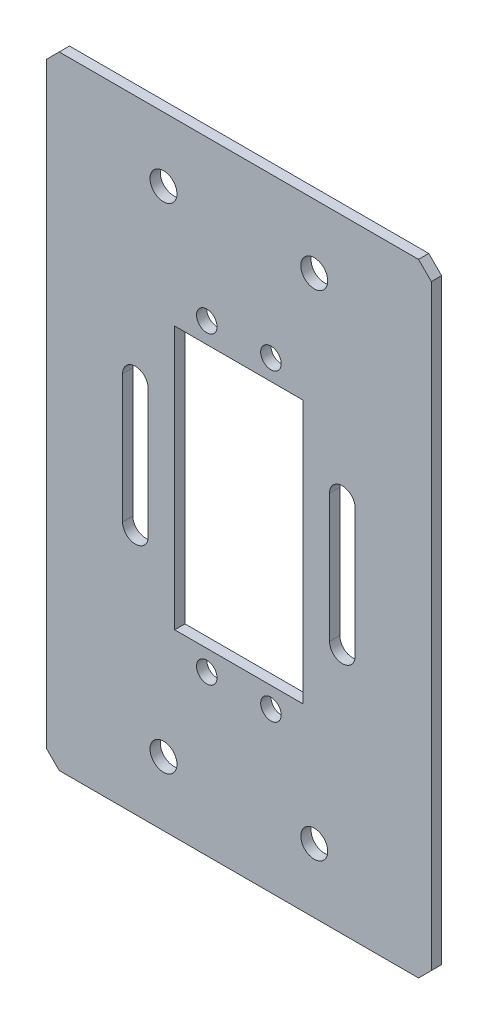
ISO-10303-21;
HEADER;
FILE_DESCRIPTION(('STEP AP214'),'2;1');
FILE_NAME('part.step','',(''),(''),'','','');
FILE_SCHEMA(('AUTOMOTIVE_DESIGN { 1 0 10303 214 1 1 1 1 }'));
ENDSEC;
DATA;
#1=APPLICATION_CONTEXT('core data for automotive mechanical design processes');
#2=APPLICATION_PROTOCOL_DEFINITION('international standard','automotive_design',2000,#1);
#3=PRODUCT_CONTEXT('',#1,'mechanical');
#4=PRODUCT('Part','Part','',(#3));
#5=PRODUCT_RELATED_PRODUCT_CATEGORY('part','',(#4));
#6=PRODUCT_DEFINITION_FORMATION('','',#4);
#7=PRODUCT_DEFINITION_CONTEXT('part definition',#1,'design');
#8=PRODUCT_DEFINITION('design','',#6,#7);
#9=PRODUCT_DEFINITION_SHAPE('','',#8);
#10=(LENGTH_UNIT() NAMED_UNIT(*) SI_UNIT(.MILLI.,.METRE.));
#11=(NAMED_UNIT(*) PLANE_ANGLE_UNIT() SI_UNIT($,.RADIAN.));
#12=(NAMED_UNIT(*) SI_UNIT($,.STERADIAN.) SOLID_ANGLE_UNIT());
#13=UNCERTAINTY_MEASURE_WITH_UNIT(LENGTH_MEASURE(1.E-05),#10,'distance_accuracy_value','');
#14=(GEOMETRIC_REPRESENTATION_CONTEXT(3) GLOBAL_UNCERTAINTY_ASSIGNED_CONTEXT((#13)) GLOBAL_UNIT_ASSIGNED_CONTEXT((#10,
#11,#12)) REPRESENTATION_CONTEXT('',''));
#15=CARTESIAN_POINT('',(0.,0.,0.));
#16=DIRECTION('',(0.,0.,1.));
#17=DIRECTION('',(1.,0.,0.));
#18=AXIS2_PLACEMENT_3D('',#15,#16,#17);
#19=CARTESIAN_POINT('',(-30.,-48.5,1.6));
#20=DIRECTION('',(0.,0.,1.));
#21=DIRECTION('',(1.,0.,0.));
#22=AXIS2_PLACEMENT_3D('',#19,#20,#21);
#23=PLANE('',#22);
#24=CARTESIAN_POINT('',(4.99999999999999,23.7,1.6));
#25=DIRECTION('',(0.,0.,1.));
#26=DIRECTION('',(-1.,0.,0.));
#27=AXIS2_PLACEMENT_3D('',#24,#25,#26);
#28=CIRCLE('',#27,1.6);
#29=CARTESIAN_POINT('',(3.4,23.7,1.6));
#30=VERTEX_POINT('',#29);
#31=EDGE_CURVE('E467',#30,#30,#28,.T.);
#32=ORIENTED_EDGE('',*,*,#31,.F.);
#33=EDGE_LOOP('',(#32));
#34=FACE_BOUND('',#33,.T.);
#35=CARTESIAN_POINT('',(11.75,-38.5,1.6));
#36=DIRECTION('',(0.,0.,1.));
#37=DIRECTION('',(1.,0.,0.));
#38=AXIS2_PLACEMENT_3D('',#35,#36,#37);
#39=CIRCLE('',#38,2.1);
#40=CARTESIAN_POINT('',(13.85,-38.5,1.6));
#41=VERTEX_POINT('',#40);
#42=EDGE_CURVE('E203',#41,#41,#39,.T.);
#43=ORIENTED_EDGE('',*,*,#42,.F.);
#44=EDGE_LOOP('',(#43));
#45=FACE_BOUND('',#44,.T.);
#46=CARTESIAN_POINT('',(-11.75,-38.5,1.6));
#47=DIRECTION('',(0.,0.,1.));
#48=DIRECTION('',(-1.,0.,0.));
#49=AXIS2_PLACEMENT_3D('',#46,#47,#48);
#50=CIRCLE('',#49,2.1);
#51=CARTESIAN_POINT('',(-13.85,-38.5,1.6));
#52=VERTEX_POINT('',#51);
#53=EDGE_CURVE('E213',#52,#52,#50,.T.);
#54=ORIENTED_EDGE('',*,*,#53,.F.);
#55=EDGE_LOOP('',(#54));
#56=FACE_BOUND('',#55,.T.);
#57=DIRECTION('',(0.,-1.,0.));
#58=VECTOR('',#57,1.);
#59=CARTESIAN_POINT('',(-18.1272264098666,10.,1.6));
#60=LINE('',#59,#58);
#61=CARTESIAN_POINT('',(-18.1272264098666,10.,1.6));
#62=VERTEX_POINT('',#61);
#63=CARTESIAN_POINT('',(-18.1272264098666,-10.,1.6));
#64=VERTEX_POINT('',#63);
#65=EDGE_CURVE('E227',#62,#64,#60,.T.);
#66=ORIENTED_EDGE('',*,*,#65,.F.);
#67=CARTESIAN_POINT('',(-16.1272264098666,10.,1.6));
#68=DIRECTION('',(0.,0.,1.));
#69=DIRECTION('',(1.,0.,0.));
#70=AXIS2_PLACEMENT_3D('',#67,#68,#69);
#71=CIRCLE('',#70,2.);
#72=CARTESIAN_POINT('',(-14.1272264098666,10.,1.6));
#73=VERTEX_POINT('',#72);
#74=EDGE_CURVE('E225',#73,#62,#71,.T.);
#75=ORIENTED_EDGE('',*,*,#74,.F.);
#76=DIRECTION('',(0.,1.,0.));
#77=VECTOR('',#76,1.);
#78=CARTESIAN_POINT('',(-14.1272264098666,-10.,1.6));
#79=LINE('',#78,#77);
#80=CARTESIAN_POINT('',(-14.1272264098666,-10.,1.6));
#81=VERTEX_POINT('',#80);
#82=EDGE_CURVE('E233',#81,#73,#79,.T.);
#83=ORIENTED_EDGE('',*,*,#82,.F.);
#84=CARTESIAN_POINT('',(-16.1272264098666,-10.,1.6));
#85=DIRECTION('',(0.,0.,1.));
#86=DIRECTION('',(1.,0.,0.));
#87=AXIS2_PLACEMENT_3D('',#84,#85,#86);
#88=CIRCLE('',#87,2.);
#89=EDGE_CURVE('E230',#64,#81,#88,.T.);
#90=ORIENTED_EDGE('',*,*,#89,.F.);
#91=EDGE_LOOP('',(#66,#75,#83,#90));
#92=FACE_BOUND('',#91,.T.);
#93=CARTESIAN_POINT('',(-11.75,38.5,1.6));
#94=DIRECTION('',(0.,0.,1.));
#95=DIRECTION('',(1.,0.,0.));
#96=AXIS2_PLACEMENT_3D('',#93,#94,#95);
#97=CIRCLE('',#96,2.1);
#98=CARTESIAN_POINT('',(-9.65,38.5,1.6));
#99=VERTEX_POINT('',#98);
#100=EDGE_CURVE('E262',#99,#99,#97,.T.);
#101=ORIENTED_EDGE('',*,*,#100,.F.);
#102=EDGE_LOOP('',(#101));
#103=FACE_BOUND('',#102,.T.);
#104=DIRECTION('',(0.,-1.,0.));
#105=VECTOR('',#104,1.);
#106=CARTESIAN_POINT('',(-30.,46.5,1.6));
#107=LINE('',#106,#105);
#108=CARTESIAN_POINT('',(-30.,46.5,1.6));
#109=VERTEX_POINT('',#108);
#110=CARTESIAN_POINT('',(-30.,-46.5,1.6));
#111=VERTEX_POINT('',#110);
#112=EDGE_CURVE('E299',#109,#111,#107,.T.);
#113=ORIENTED_EDGE('',*,*,#112,.T.);
#114=DIRECTION('',(0.707106781186545,-0.70710678118655,0.));
#115=VECTOR('',#114,1.);
#116=CARTESIAN_POINT('',(-28.,-48.5,1.6));
#117=LINE('',#116,#115);
#118=CARTESIAN_POINT('',(-28.,-48.5,1.6));
#119=VERTEX_POINT('',#118);
#120=EDGE_CURVE('E302',#111,#119,#117,.T.);
#121=ORIENTED_EDGE('',*,*,#120,.T.);
#122=DIRECTION('',(1.,0.,0.));
#123=VECTOR('',#122,1.);
#124=CARTESIAN_POINT('',(-28.,-48.5,1.6));
#125=LINE('',#124,#123);
#126=CARTESIAN_POINT('',(28.,-48.5,1.6));
#127=VERTEX_POINT('',#126);
#128=EDGE_CURVE('E305',#119,#127,#125,.T.);
#129=ORIENTED_EDGE('',*,*,#128,.T.);
#130=DIRECTION('',(0.707106781186547,0.707106781186547,0.));
#131=VECTOR('',#130,1.);
#132=CARTESIAN_POINT('',(28.,-48.5,1.6));
#133=LINE('',#132,#131);
#134=CARTESIAN_POINT('',(30.,-46.5,1.6));
#135=VERTEX_POINT('',#134);
#136=EDGE_CURVE('E307',#127,#135,#133,.T.);
#137=ORIENTED_EDGE('',*,*,#136,.T.);
#138=DIRECTION('',(0.,1.,0.));
#139=VECTOR('',#138,1.);
#140=CARTESIAN_POINT('',(30.,46.5,1.6));
#141=LINE('',#140,#139);
#142=CARTESIAN_POINT('',(30.,46.5,1.6));
#143=VERTEX_POINT('',#142);
#144=EDGE_CURVE('E309',#135,#143,#141,.T.);
#145=ORIENTED_EDGE('',*,*,#144,.T.);
#146=DIRECTION('',(-0.707106781186551,0.707106781186544,0.));
#147=VECTOR('',#146,1.);
#148=CARTESIAN_POINT('',(30.,46.5,1.6));
#149=LINE('',#148,#147);
#150=CARTESIAN_POINT('',(28.,48.5,1.6));
#151=VERTEX_POINT('',#150);
#152=EDGE_CURVE('E311',#143,#151,#149,.T.);
#153=ORIENTED_EDGE('',*,*,#152,.T.);
#154=DIRECTION('',(-1.,0.,0.));
#155=VECTOR('',#154,1.);
#156=CARTESIAN_POINT('',(-28.,48.5,1.6));
#157=LINE('',#156,#155);
#158=CARTESIAN_POINT('',(-28.,48.5,1.6));
#159=VERTEX_POINT('',#158);
#160=EDGE_CURVE('E313',#151,#159,#157,.T.);
#161=ORIENTED_EDGE('',*,*,#160,.T.);
#162=DIRECTION('',(-0.707106781186548,-0.707106781186548,0.));
#163=VECTOR('',#162,1.);
#164=CARTESIAN_POINT('',(-30.,46.5,1.6));
#165=LINE('',#164,#163);
#166=EDGE_CURVE('E315',#159,#109,#165,.T.);
#167=ORIENTED_EDGE('',*,*,#166,.T.);
#168=EDGE_LOOP('',(#113,#121,#129,#137,#145,#153,#161,#167));
#169=FACE_BOUND('',#168,.T.);
#170=DIRECTION('',(1.,0.,0.));
#171=VECTOR('',#170,1.);
#172=CARTESIAN_POINT('',(-10.,-20.5,1.6));
#173=LINE('',#172,#171);
#174=CARTESIAN_POINT('',(-10.,-20.5,1.6));
#175=VERTEX_POINT('',#174);
#176=CARTESIAN_POINT('',(10.,-20.5,1.6));
#177=VERTEX_POINT('',#176);
#178=EDGE_CURVE('E270',#175,#177,#173,.T.);
#179=ORIENTED_EDGE('',*,*,#178,.F.);
#180=DIRECTION('',(0.,-1.,0.));
#181=VECTOR('',#180,1.);
#182=CARTESIAN_POINT('',(-10.,20.5,1.6));
#183=LINE('',#182,#181);
#184=CARTESIAN_POINT('',(-10.,20.5,1.6));
#185=VERTEX_POINT('',#184);
#186=EDGE_CURVE('E268',#185,#175,#183,.T.);
#187=ORIENTED_EDGE('',*,*,#186,.F.);
#188=DIRECTION('',(-1.,0.,0.));
#189=VECTOR('',#188,1.);
#190=CARTESIAN_POINT('',(-10.,20.5,1.6));
#191=LINE('',#190,#189);
#192=CARTESIAN_POINT('',(10.,20.5,1.6));
#193=VERTEX_POINT('',#192);
#194=EDGE_CURVE('E276',#193,#185,#191,.T.);
#195=ORIENTED_EDGE('',*,*,#194,.F.);
#196=DIRECTION('',(0.,1.,0.));
#197=VECTOR('',#196,1.);
#198=CARTESIAN_POINT('',(10.,20.5,1.6));
#199=LINE('',#198,#197);
#200=EDGE_CURVE('E273',#177,#193,#199,.T.);
#201=ORIENTED_EDGE('',*,*,#200,.F.);
#202=EDGE_LOOP('',(#179,#187,#195,#201));
#203=FACE_BOUND('',#202,.T.);
#204=CARTESIAN_POINT('',(-4.99999999999999,23.7,1.6));
#205=DIRECTION('',(0.,0.,1.));
#206=DIRECTION('',(1.,0.,0.));
#207=AXIS2_PLACEMENT_3D('',#204,#205,#206);
#208=CIRCLE('',#207,1.6);
#209=CARTESIAN_POINT('',(-3.4,23.7,1.6));
#210=VERTEX_POINT('',#209);
#211=EDGE_CURVE('E256',#210,#210,#208,.T.);
#212=ORIENTED_EDGE('',*,*,#211,.F.);
#213=EDGE_LOOP('',(#212));
#214=FACE_BOUND('',#213,.T.);
#215=CARTESIAN_POINT('',(-4.99999999999999,-23.7,1.6));
#216=DIRECTION('',(0.,0.,1.));
#217=DIRECTION('',(-1.,0.,0.));
#218=AXIS2_PLACEMENT_3D('',#215,#216,#217);
#219=CIRCLE('',#218,1.6);
#220=CARTESIAN_POINT('',(-6.59999999999999,-23.7,1.6));
#221=VERTEX_POINT('',#220);
#222=EDGE_CURVE('E219',#221,#221,#219,.T.);
#223=ORIENTED_EDGE('',*,*,#222,.F.);
#224=EDGE_LOOP('',(#223));
#225=FACE_BOUND('',#224,.T.);
#226=DIRECTION('',(0.,1.,0.));
#227=VECTOR('',#226,1.);
#228=CARTESIAN_POINT('',(18.1272264098666,10.,1.6));
#229=LINE('',#228,#227);
#230=CARTESIAN_POINT('',(18.1272264098666,-10.,1.6));
#231=VERTEX_POINT('',#230);
#232=CARTESIAN_POINT('',(18.1272264098666,10.,1.6));
#233=VERTEX_POINT('',#232);
#234=EDGE_CURVE('E182',#231,#233,#229,.T.);
#235=ORIENTED_EDGE('',*,*,#234,.F.);
#236=CARTESIAN_POINT('',(16.1272264098666,-10.,1.6));
#237=DIRECTION('',(0.,0.,1.));
#238=DIRECTION('',(-1.,0.,0.));
#239=AXIS2_PLACEMENT_3D('',#236,#237,#238);
#240=CIRCLE('',#239,2.);
#241=CARTESIAN_POINT('',(14.1272264098666,-10.,1.6));
#242=VERTEX_POINT('',#241);
#243=EDGE_CURVE('E174',#242,#231,#240,.T.);
#244=ORIENTED_EDGE('',*,*,#243,.F.);
#245=DIRECTION('',(0.,-1.,0.));
#246=VECTOR('',#245,1.);
#247=CARTESIAN_POINT('',(14.1272264098666,-10.,1.6));
#248=LINE('',#247,#246);
#249=CARTESIAN_POINT('',(14.1272264098666,10.,1.6));
#250=VERTEX_POINT('',#249);
#251=EDGE_CURVE('E197',#250,#242,#248,.T.);
#252=ORIENTED_EDGE('',*,*,#251,.F.);
#253=CARTESIAN_POINT('',(16.1272264098666,10.,1.6));
#254=DIRECTION('',(0.,0.,1.));
#255=DIRECTION('',(-1.,0.,0.));
#256=AXIS2_PLACEMENT_3D('',#253,#254,#255);
#257=CIRCLE('',#256,2.);
#258=EDGE_CURVE('E195',#233,#250,#257,.T.);
#259=ORIENTED_EDGE('',*,*,#258,.F.);
#260=EDGE_LOOP('',(#235,#244,#252,#259));
#261=FACE_BOUND('',#260,.T.);
#262=CARTESIAN_POINT('',(4.99999999999999,-23.7,1.6));
#263=DIRECTION('',(0.,0.,1.));
#264=DIRECTION('',(1.,0.,0.));
#265=AXIS2_PLACEMENT_3D('',#262,#263,#264);
#266=CIRCLE('',#265,1.6);
#267=CARTESIAN_POINT('',(6.59999999999999,-23.7,1.6));
#268=VERTEX_POINT('',#267);
#269=EDGE_CURVE('E472',#268,#268,#266,.T.);
#270=ORIENTED_EDGE('',*,*,#269,.F.);
#271=EDGE_LOOP('',(#270));
#272=FACE_BOUND('',#271,.T.);
#273=CARTESIAN_POINT('',(11.75,38.5,1.6));
#274=DIRECTION('',(0.,0.,1.));
#275=DIRECTION('',(-1.,0.,0.));
#276=AXIS2_PLACEMENT_3D('',#273,#274,#275);
#277=CIRCLE('',#276,2.1);
#278=CARTESIAN_POINT('',(9.65000000000003,38.5,1.6));
#279=VERTEX_POINT('',#278);
#280=EDGE_CURVE('E461',#279,#279,#277,.T.);
#281=ORIENTED_EDGE('',*,*,#280,.F.);
#282=EDGE_LOOP('',(#281));
#283=FACE_BOUND('',#282,.T.);
#284=ADVANCED_FACE('F37',(#34,#45,#56,#92,#103,#169,#203,#214,#225,#261,#272,#283),#23,.T.);
#285=CARTESIAN_POINT('',(-30.,-48.5,0.));
#286=DIRECTION('',(0.,0.,1.));
#287=DIRECTION('',(1.,0.,0.));
#288=AXIS2_PLACEMENT_3D('',#285,#286,#287);
#289=PLANE('',#288);
#290=CARTESIAN_POINT('',(4.99999999999999,23.7,0.));
#291=DIRECTION('',(0.,0.,1.));
#292=DIRECTION('',(-1.,0.,0.));
#293=AXIS2_PLACEMENT_3D('',#290,#291,#292);
#294=CIRCLE('',#293,1.6);
#295=CARTESIAN_POINT('',(3.4,23.7,0.));
#296=VERTEX_POINT('',#295);
#297=EDGE_CURVE('E464',#296,#296,#294,.T.);
#298=ORIENTED_EDGE('',*,*,#297,.T.);
#299=EDGE_LOOP('',(#298));
#300=FACE_BOUND('',#299,.T.);
#301=CARTESIAN_POINT('',(11.75,-38.5,0.));
#302=DIRECTION('',(0.,0.,1.));
#303=DIRECTION('',(1.,0.,0.));
#304=AXIS2_PLACEMENT_3D('',#301,#302,#303);
#305=CIRCLE('',#304,2.1);
#306=CARTESIAN_POINT('',(13.85,-38.5,0.));
#307=VERTEX_POINT('',#306);
#308=EDGE_CURVE('E475',#307,#307,#305,.T.);
#309=ORIENTED_EDGE('',*,*,#308,.T.);
#310=EDGE_LOOP('',(#309));
#311=FACE_BOUND('',#310,.T.);
#312=CARTESIAN_POINT('',(-11.75,-38.5,0.));
#313=DIRECTION('',(0.,0.,1.));
#314=DIRECTION('',(-1.,0.,0.));
#315=AXIS2_PLACEMENT_3D('',#312,#313,#314);
#316=CIRCLE('',#315,2.1);
#317=CARTESIAN_POINT('',(-13.85,-38.5,0.));
#318=VERTEX_POINT('',#317);
#319=EDGE_CURVE('E190',#318,#318,#316,.T.);
#320=ORIENTED_EDGE('',*,*,#319,.T.);
#321=EDGE_LOOP('',(#320));
#322=FACE_BOUND('',#321,.T.);
#323=CARTESIAN_POINT('',(-16.1272264098666,10.,0.));
#324=DIRECTION('',(0.,0.,1.));
#325=DIRECTION('',(1.,0.,0.));
#326=AXIS2_PLACEMENT_3D('',#323,#324,#325);
#327=CIRCLE('',#326,2.);
#328=CARTESIAN_POINT('',(-14.1272264098666,10.,0.));
#329=VERTEX_POINT('',#328);
#330=CARTESIAN_POINT('',(-18.1272264098666,10.,0.));
#331=VERTEX_POINT('',#330);
#332=EDGE_CURVE('E222',#329,#331,#327,.T.);
#333=ORIENTED_EDGE('',*,*,#332,.T.);
#334=DIRECTION('',(0.,-1.,0.));
#335=VECTOR('',#334,1.);
#336=CARTESIAN_POINT('',(-18.1272264098666,10.,0.));
#337=LINE('',#336,#335);
#338=CARTESIAN_POINT('',(-18.1272264098666,-10.,0.));
#339=VERTEX_POINT('',#338);
#340=EDGE_CURVE('E238',#331,#339,#337,.T.);
#341=ORIENTED_EDGE('',*,*,#340,.T.);
#342=CARTESIAN_POINT('',(-16.1272264098666,-10.,0.));
#343=DIRECTION('',(0.,0.,1.));
#344=DIRECTION('',(1.,0.,0.));
#345=AXIS2_PLACEMENT_3D('',#342,#343,#344);
#346=CIRCLE('',#345,2.);
#347=CARTESIAN_POINT('',(-14.1272264098666,-10.,0.));
#348=VERTEX_POINT('',#347);
#349=EDGE_CURVE('E241',#339,#348,#346,.T.);
#350=ORIENTED_EDGE('',*,*,#349,.T.);
#351=DIRECTION('',(0.,1.,0.));
#352=VECTOR('',#351,1.);
#353=CARTESIAN_POINT('',(-14.1272264098666,-10.,0.));
#354=LINE('',#353,#352);
#355=EDGE_CURVE('E228',#348,#329,#354,.T.);
#356=ORIENTED_EDGE('',*,*,#355,.T.);
#357=EDGE_LOOP('',(#333,#341,#350,#356));
#358=FACE_BOUND('',#357,.T.);
#359=CARTESIAN_POINT('',(-11.75,38.5,0.));
#360=DIRECTION('',(0.,0.,1.));
#361=DIRECTION('',(1.,0.,0.));
#362=AXIS2_PLACEMENT_3D('',#359,#360,#361);
#363=CIRCLE('',#362,2.1);
#364=CARTESIAN_POINT('',(-9.65,38.5,0.));
#365=VERTEX_POINT('',#364);
#366=EDGE_CURVE('E259',#365,#365,#363,.T.);
#367=ORIENTED_EDGE('',*,*,#366,.T.);
#368=EDGE_LOOP('',(#367));
#369=FACE_BOUND('',#368,.T.);
#370=DIRECTION('',(0.,-1.,0.));
#371=VECTOR('',#370,1.);
#372=CARTESIAN_POINT('',(-30.,46.5,0.));
#373=LINE('',#372,#371);
#374=CARTESIAN_POINT('',(-30.,46.5,0.));
#375=VERTEX_POINT('',#374);
#376=CARTESIAN_POINT('',(-30.,-46.5,0.));
#377=VERTEX_POINT('',#376);
#378=EDGE_CURVE('E298',#375,#377,#373,.T.);
#379=ORIENTED_EDGE('',*,*,#378,.F.);
#380=DIRECTION('',(-0.707106781186548,-0.707106781186548,0.));
#381=VECTOR('',#380,1.);
#382=CARTESIAN_POINT('',(-30.,46.5,0.));
#383=LINE('',#382,#381);
#384=CARTESIAN_POINT('',(-28.,48.5,0.));
#385=VERTEX_POINT('',#384);
#386=EDGE_CURVE('E303',#385,#375,#383,.T.);
#387=ORIENTED_EDGE('',*,*,#386,.F.);
#388=DIRECTION('',(-1.,0.,0.));
#389=VECTOR('',#388,1.);
#390=CARTESIAN_POINT('',(-28.,48.5,0.));
#391=LINE('',#390,#389);
#392=CARTESIAN_POINT('',(28.,48.5,0.));
#393=VERTEX_POINT('',#392);
#394=EDGE_CURVE('E330',#393,#385,#391,.T.);
#395=ORIENTED_EDGE('',*,*,#394,.F.);
#396=DIRECTION('',(-0.707106781186551,0.707106781186544,0.));
#397=VECTOR('',#396,1.);
#398=CARTESIAN_POINT('',(30.,46.5,0.));
#399=LINE('',#398,#397);
#400=CARTESIAN_POINT('',(30.,46.5,0.));
#401=VERTEX_POINT('',#400);
#402=EDGE_CURVE('E328',#401,#393,#399,.T.);
#403=ORIENTED_EDGE('',*,*,#402,.F.);
#404=DIRECTION('',(0.,1.,0.));
#405=VECTOR('',#404,1.);
#406=CARTESIAN_POINT('',(30.,46.5,0.));
#407=LINE('',#406,#405);
#408=CARTESIAN_POINT('',(30.,-46.5,0.));
#409=VERTEX_POINT('',#408);
#410=EDGE_CURVE('E326',#409,#401,#407,.T.);
#411=ORIENTED_EDGE('',*,*,#410,.F.);
#412=DIRECTION('',(0.707106781186547,0.707106781186547,0.));
#413=VECTOR('',#412,1.);
#414=CARTESIAN_POINT('',(28.,-48.5,0.));
#415=LINE('',#414,#413);
#416=CARTESIAN_POINT('',(28.,-48.5,0.));
#417=VERTEX_POINT('',#416);
#418=EDGE_CURVE('E324',#417,#409,#415,.T.);
#419=ORIENTED_EDGE('',*,*,#418,.F.);
#420=DIRECTION('',(1.,0.,0.));
#421=VECTOR('',#420,1.);
#422=CARTESIAN_POINT('',(-28.,-48.5,0.));
#423=LINE('',#422,#421);
#424=CARTESIAN_POINT('',(-28.,-48.5,0.));
#425=VERTEX_POINT('',#424);
#426=EDGE_CURVE('E322',#425,#417,#423,.T.);
#427=ORIENTED_EDGE('',*,*,#426,.F.);
#428=DIRECTION('',(0.707106781186545,-0.70710678118655,0.));
#429=VECTOR('',#428,1.);
#430=CARTESIAN_POINT('',(-28.,-48.5,0.));
#431=LINE('',#430,#429);
#432=EDGE_CURVE('E320',#377,#425,#431,.T.);
#433=ORIENTED_EDGE('',*,*,#432,.F.);
#434=EDGE_LOOP('',(#379,#387,#395,#403,#411,#419,#427,#433));
#435=FACE_BOUND('',#434,.T.);
#436=DIRECTION('',(0.,-1.,0.));
#437=VECTOR('',#436,1.);
#438=CARTESIAN_POINT('',(-10.,20.5,0.));
#439=LINE('',#438,#437);
#440=CARTESIAN_POINT('',(-10.,20.5,0.));
#441=VERTEX_POINT('',#440);
#442=CARTESIAN_POINT('',(-10.,-20.5,0.));
#443=VERTEX_POINT('',#442);
#444=EDGE_CURVE('E265',#441,#443,#439,.T.);
#445=ORIENTED_EDGE('',*,*,#444,.T.);
#446=DIRECTION('',(1.,0.,0.));
#447=VECTOR('',#446,1.);
#448=CARTESIAN_POINT('',(-10.,-20.5,0.));
#449=LINE('',#448,#447);
#450=CARTESIAN_POINT('',(10.,-20.5,0.));
#451=VERTEX_POINT('',#450);
#452=EDGE_CURVE('E281',#443,#451,#449,.T.);
#453=ORIENTED_EDGE('',*,*,#452,.T.);
#454=DIRECTION('',(0.,1.,0.));
#455=VECTOR('',#454,1.);
#456=CARTESIAN_POINT('',(10.,20.5,0.));
#457=LINE('',#456,#455);
#458=CARTESIAN_POINT('',(10.,20.5,0.));
#459=VERTEX_POINT('',#458);
#460=EDGE_CURVE('E284',#451,#459,#457,.T.);
#461=ORIENTED_EDGE('',*,*,#460,.T.);
#462=DIRECTION('',(-1.,0.,0.));
#463=VECTOR('',#462,1.);
#464=CARTESIAN_POINT('',(-10.,20.5,0.));
#465=LINE('',#464,#463);
#466=EDGE_CURVE('E271',#459,#441,#465,.T.);
#467=ORIENTED_EDGE('',*,*,#466,.T.);
#468=EDGE_LOOP('',(#445,#453,#461,#467));
#469=FACE_BOUND('',#468,.T.);
#470=CARTESIAN_POINT('',(-4.99999999999999,23.7,0.));
#471=DIRECTION('',(0.,0.,1.));
#472=DIRECTION('',(1.,0.,0.));
#473=AXIS2_PLACEMENT_3D('',#470,#471,#472);
#474=CIRCLE('',#473,1.6);
#475=CARTESIAN_POINT('',(-3.4,23.7,0.));
#476=VERTEX_POINT('',#475);
#477=EDGE_CURVE('E255',#476,#476,#474,.T.);
#478=ORIENTED_EDGE('',*,*,#477,.T.);
#479=EDGE_LOOP('',(#478));
#480=FACE_BOUND('',#479,.T.);
#481=CARTESIAN_POINT('',(-4.99999999999999,-23.7,0.));
#482=DIRECTION('',(0.,0.,1.));
#483=DIRECTION('',(-1.,0.,0.));
#484=AXIS2_PLACEMENT_3D('',#481,#482,#483);
#485=CIRCLE('',#484,1.6);
#486=CARTESIAN_POINT('',(-6.59999999999999,-23.7,0.));
#487=VERTEX_POINT('',#486);
#488=EDGE_CURVE('E216',#487,#487,#485,.T.);
#489=ORIENTED_EDGE('',*,*,#488,.T.);
#490=EDGE_LOOP('',(#489));
#491=FACE_BOUND('',#490,.T.);
#492=CARTESIAN_POINT('',(16.1272264098666,-10.,0.));
#493=DIRECTION('',(0.,0.,1.));
#494=DIRECTION('',(-1.,0.,0.));
#495=AXIS2_PLACEMENT_3D('',#492,#493,#494);
#496=CIRCLE('',#495,2.);
#497=CARTESIAN_POINT('',(14.1272264098666,-10.,0.));
#498=VERTEX_POINT('',#497);
#499=CARTESIAN_POINT('',(18.1272264098666,-10.,0.));
#500=VERTEX_POINT('',#499);
#501=EDGE_CURVE('E60',#498,#500,#496,.T.);
#502=ORIENTED_EDGE('',*,*,#501,.T.);
#503=DIRECTION('',(0.,1.,0.));
#504=VECTOR('',#503,1.);
#505=CARTESIAN_POINT('',(18.1272264098666,10.,0.));
#506=LINE('',#505,#504);
#507=CARTESIAN_POINT('',(18.1272264098666,10.,0.));
#508=VERTEX_POINT('',#507);
#509=EDGE_CURVE('E189',#500,#508,#506,.T.);
#510=ORIENTED_EDGE('',*,*,#509,.T.);
#511=CARTESIAN_POINT('',(16.1272264098666,10.,0.));
#512=DIRECTION('',(0.,0.,1.));
#513=DIRECTION('',(-1.,0.,0.));
#514=AXIS2_PLACEMENT_3D('',#511,#512,#513);
#515=CIRCLE('',#514,2.);
#516=CARTESIAN_POINT('',(14.1272264098666,10.,0.));
#517=VERTEX_POINT('',#516);
#518=EDGE_CURVE('E205',#508,#517,#515,.T.);
#519=ORIENTED_EDGE('',*,*,#518,.T.);
#520=DIRECTION('',(0.,-1.,0.));
#521=VECTOR('',#520,1.);
#522=CARTESIAN_POINT('',(14.1272264098666,-10.,0.));
#523=LINE('',#522,#521);
#524=EDGE_CURVE('E183',#517,#498,#523,.T.);
#525=ORIENTED_EDGE('',*,*,#524,.T.);
#526=EDGE_LOOP('',(#502,#510,#519,#525));
#527=FACE_BOUND('',#526,.T.);
#528=CARTESIAN_POINT('',(4.99999999999999,-23.7,0.));
#529=DIRECTION('',(0.,0.,1.));
#530=DIRECTION('',(1.,0.,0.));
#531=AXIS2_PLACEMENT_3D('',#528,#529,#530);
#532=CIRCLE('',#531,1.6);
#533=CARTESIAN_POINT('',(6.59999999999999,-23.7,0.));
#534=VERTEX_POINT('',#533);
#535=EDGE_CURVE('E456',#534,#534,#532,.T.);
#536=ORIENTED_EDGE('',*,*,#535,.T.);
#537=EDGE_LOOP('',(#536));
#538=FACE_BOUND('',#537,.T.);
#539=CARTESIAN_POINT('',(11.75,38.5,0.));
#540=DIRECTION('',(0.,0.,1.));
#541=DIRECTION('',(-1.,0.,0.));
#542=AXIS2_PLACEMENT_3D('',#539,#540,#541);
#543=CIRCLE('',#542,2.1);
#544=CARTESIAN_POINT('',(9.65000000000003,38.5,0.));
#545=VERTEX_POINT('',#544);
#546=EDGE_CURVE('E459',#545,#545,#543,.T.);
#547=ORIENTED_EDGE('',*,*,#546,.T.);
#548=EDGE_LOOP('',(#547));
#549=FACE_BOUND('',#548,.T.);
#550=ADVANCED_FACE('F360',(#300,#311,#322,#358,#369,#435,#469,#480,#491,#527,#538,#549),#289,.F.);
#551=CARTESIAN_POINT('',(-30.,46.5,1.6));
#552=DIRECTION('',(1.,0.,0.));
#553=DIRECTION('',(0.,0.,-1.));
#554=AXIS2_PLACEMENT_3D('',#551,#552,#553);
#555=PLANE('',#554);
#556=ORIENTED_EDGE('',*,*,#378,.T.);
#557=DIRECTION('',(0.,0.,-1.));
#558=VECTOR('',#557,1.);
#559=CARTESIAN_POINT('',(-30.,-46.5,1.6));
#560=LINE('',#559,#558);
#561=EDGE_CURVE('E11',#111,#377,#560,.T.);
#562=ORIENTED_EDGE('',*,*,#561,.F.);
#563=ORIENTED_EDGE('',*,*,#112,.F.);
#564=DIRECTION('',(0.,0.,-1.));
#565=VECTOR('',#564,1.);
#566=CARTESIAN_POINT('',(-30.,46.5,1.6));
#567=LINE('',#566,#565);
#568=EDGE_CURVE('E317',#109,#375,#567,.T.);
#569=ORIENTED_EDGE('',*,*,#568,.T.);
#570=EDGE_LOOP('',(#556,#562,#563,#569));
#571=FACE_BOUND('',#570,.T.);
#572=ADVANCED_FACE('F39',(#571),#555,.F.);
#573=CARTESIAN_POINT('',(-28.,-48.5,1.6));
#574=DIRECTION('',(0.70710678118655,0.707106781186545,0.));
#575=DIRECTION('',(-0.707106781186545,0.70710678118655,0.));
#576=AXIS2_PLACEMENT_3D('',#573,#574,#575);
#577=PLANE('',#576);
#578=ORIENTED_EDGE('',*,*,#432,.T.);
#579=DIRECTION('',(0.,0.,-1.));
#580=VECTOR('',#579,1.);
#581=CARTESIAN_POINT('',(-28.,-48.5,1.6));
#582=LINE('',#581,#580);
#583=EDGE_CURVE('E45',#119,#425,#582,.T.);
#584=ORIENTED_EDGE('',*,*,#583,.F.);
#585=ORIENTED_EDGE('',*,*,#120,.F.);
#586=ORIENTED_EDGE('',*,*,#561,.T.);
#587=EDGE_LOOP('',(#578,#584,#585,#586));
#588=FACE_BOUND('',#587,.T.);
#589=ADVANCED_FACE('F378',(#588),#577,.F.);
#590=CARTESIAN_POINT('',(-28.,-48.5,1.6));
#591=DIRECTION('',(0.,1.,0.));
#592=DIRECTION('',(-1.,0.,0.));
#593=AXIS2_PLACEMENT_3D('',#590,#591,#592);
#594=PLANE('',#593);
#595=ORIENTED_EDGE('',*,*,#426,.T.);
#596=DIRECTION('',(0.,0.,-1.));
#597=VECTOR('',#596,1.);
#598=CARTESIAN_POINT('',(28.,-48.5,1.6));
#599=LINE('',#598,#597);
#600=EDGE_CURVE('E347',#127,#417,#599,.T.);
#601=ORIENTED_EDGE('',*,*,#600,.F.);
#602=ORIENTED_EDGE('',*,*,#128,.F.);
#603=ORIENTED_EDGE('',*,*,#583,.T.);
#604=EDGE_LOOP('',(#595,#601,#602,#603));
#605=FACE_BOUND('',#604,.T.);
#606=ADVANCED_FACE('F354',(#605),#594,.F.);
#607=CARTESIAN_POINT('',(28.,-48.5,1.6));
#608=DIRECTION('',(-0.707106781186548,0.707106781186548,0.));
#609=DIRECTION('',(-0.707106781186548,-0.707106781186548,0.));
#610=AXIS2_PLACEMENT_3D('',#607,#608,#609);
#611=PLANE('',#610);
#612=ORIENTED_EDGE('',*,*,#418,.T.);
#613=DIRECTION('',(0.,0.,-1.));
#614=VECTOR('',#613,1.);
#615=CARTESIAN_POINT('',(30.,-46.5,1.6));
#616=LINE('',#615,#614);
#617=EDGE_CURVE('E344',#135,#409,#616,.T.);
#618=ORIENTED_EDGE('',*,*,#617,.F.);
#619=ORIENTED_EDGE('',*,*,#136,.F.);
#620=ORIENTED_EDGE('',*,*,#600,.T.);
#621=EDGE_LOOP('',(#612,#618,#619,#620));
#622=FACE_BOUND('',#621,.T.);
#623=ADVANCED_FACE('F366',(#622),#611,.F.);
#624=CARTESIAN_POINT('',(30.,46.5,1.6));
#625=DIRECTION('',(-1.,0.,0.));
#626=DIRECTION('',(0.,-1.,0.));
#627=AXIS2_PLACEMENT_3D('',#624,#625,#626);
#628=PLANE('',#627);
#629=ORIENTED_EDGE('',*,*,#410,.T.);
#630=DIRECTION('',(0.,0.,-1.));
#631=VECTOR('',#630,1.);
#632=CARTESIAN_POINT('',(30.,46.5,1.6));
#633=LINE('',#632,#631);
#634=EDGE_CURVE('E341',#143,#401,#633,.T.);
#635=ORIENTED_EDGE('',*,*,#634,.F.);
#636=ORIENTED_EDGE('',*,*,#144,.F.);
#637=ORIENTED_EDGE('',*,*,#617,.T.);
#638=EDGE_LOOP('',(#629,#635,#636,#637));
#639=FACE_BOUND('',#638,.T.);
#640=ADVANCED_FACE('F370',(#639),#628,.F.);
#641=CARTESIAN_POINT('',(30.,46.5,1.6));
#642=DIRECTION('',(-0.707106781186544,-0.707106781186551,0.));
#643=DIRECTION('',(0.707106781186551,-0.707106781186544,0.));
#644=AXIS2_PLACEMENT_3D('',#641,#642,#643);
#645=PLANE('',#644);
#646=ORIENTED_EDGE('',*,*,#402,.T.);
#647=DIRECTION('',(0.,0.,-1.));
#648=VECTOR('',#647,1.);
#649=CARTESIAN_POINT('',(28.,48.5,1.6));
#650=LINE('',#649,#648);
#651=EDGE_CURVE('E338',#151,#393,#650,.T.);
#652=ORIENTED_EDGE('',*,*,#651,.F.);
#653=ORIENTED_EDGE('',*,*,#152,.F.);
#654=ORIENTED_EDGE('',*,*,#634,.T.);
#655=EDGE_LOOP('',(#646,#652,#653,#654));
#656=FACE_BOUND('',#655,.T.);
#657=ADVANCED_FACE('F391',(#656),#645,.F.);
#658=CARTESIAN_POINT('',(-28.,48.5,1.6));
#659=DIRECTION('',(0.,-1.,0.));
#660=DIRECTION('',(1.,0.,0.));
#661=AXIS2_PLACEMENT_3D('',#658,#659,#660);
#662=PLANE('',#661);
#663=ORIENTED_EDGE('',*,*,#394,.T.);
#664=DIRECTION('',(0.,0.,-1.));
#665=VECTOR('',#664,1.);
#666=CARTESIAN_POINT('',(-28.,48.5,1.6));
#667=LINE('',#666,#665);
#668=EDGE_CURVE('E335',#159,#385,#667,.T.);
#669=ORIENTED_EDGE('',*,*,#668,.F.);
#670=ORIENTED_EDGE('',*,*,#160,.F.);
#671=ORIENTED_EDGE('',*,*,#651,.T.);
#672=EDGE_LOOP('',(#663,#669,#670,#671));
#673=FACE_BOUND('',#672,.T.);
#674=ADVANCED_FACE('F389',(#673),#662,.F.);
#675=CARTESIAN_POINT('',(-30.,46.5,1.6));
#676=DIRECTION('',(0.707106781186548,-0.707106781186548,0.));
#677=DIRECTION('',(0.707106781186548,0.707106781186548,0.));
#678=AXIS2_PLACEMENT_3D('',#675,#676,#677);
#679=PLANE('',#678);
#680=ORIENTED_EDGE('',*,*,#386,.T.);
#681=ORIENTED_EDGE('',*,*,#568,.F.);
#682=ORIENTED_EDGE('',*,*,#166,.F.);
#683=ORIENTED_EDGE('',*,*,#668,.T.);
#684=EDGE_LOOP('',(#680,#681,#682,#683));
#685=FACE_BOUND('',#684,.T.);
#686=ADVANCED_FACE('F384',(#685),#679,.F.);
#687=CARTESIAN_POINT('',(-10.,20.5,1.6));
#688=DIRECTION('',(1.,0.,0.));
#689=DIRECTION('',(0.,1.,0.));
#690=AXIS2_PLACEMENT_3D('',#687,#688,#689);
#691=PLANE('',#690);
#692=ORIENTED_EDGE('',*,*,#444,.F.);
#693=DIRECTION('',(0.,0.,-1.));
#694=VECTOR('',#693,1.);
#695=CARTESIAN_POINT('',(-10.,20.5,1.6));
#696=LINE('',#695,#694);
#697=EDGE_CURVE('E278',#185,#441,#696,.T.);
#698=ORIENTED_EDGE('',*,*,#697,.F.);
#699=ORIENTED_EDGE('',*,*,#186,.T.);
#700=DIRECTION('',(0.,0.,-1.));
#701=VECTOR('',#700,1.);
#702=CARTESIAN_POINT('',(-10.,-20.5,1.6));
#703=LINE('',#702,#701);
#704=EDGE_CURVE('E295',#175,#443,#703,.T.);
#705=ORIENTED_EDGE('',*,*,#704,.T.);
#706=EDGE_LOOP('',(#692,#698,#699,#705));
#707=FACE_BOUND('',#706,.T.);
#708=ADVANCED_FACE('F411',(#707),#691,.T.);
#709=CARTESIAN_POINT('',(-10.,-20.5,1.6));
#710=DIRECTION('',(0.,1.,0.));
#711=DIRECTION('',(-1.,0.,0.));
#712=AXIS2_PLACEMENT_3D('',#709,#710,#711);
#713=PLANE('',#712);
#714=ORIENTED_EDGE('',*,*,#452,.F.);
#715=ORIENTED_EDGE('',*,*,#704,.F.);
#716=ORIENTED_EDGE('',*,*,#178,.T.);
#717=DIRECTION('',(0.,0.,-1.));
#718=VECTOR('',#717,1.);
#719=CARTESIAN_POINT('',(10.,-20.5,1.6));
#720=LINE('',#719,#718);
#721=EDGE_CURVE('E293',#177,#451,#720,.T.);
#722=ORIENTED_EDGE('',*,*,#721,.T.);
#723=EDGE_LOOP('',(#714,#715,#716,#722));
#724=FACE_BOUND('',#723,.T.);
#725=ADVANCED_FACE('F418',(#724),#713,.T.);
#726=CARTESIAN_POINT('',(10.,20.5,1.6));
#727=DIRECTION('',(-1.,0.,0.));
#728=DIRECTION('',(0.,-1.,0.));
#729=AXIS2_PLACEMENT_3D('',#726,#727,#728);
#730=PLANE('',#729);
#731=ORIENTED_EDGE('',*,*,#460,.F.);
#732=ORIENTED_EDGE('',*,*,#721,.F.);
#733=ORIENTED_EDGE('',*,*,#200,.T.);
#734=DIRECTION('',(0.,0.,-1.));
#735=VECTOR('',#734,1.);
#736=CARTESIAN_POINT('',(10.,20.5,1.6));
#737=LINE('',#736,#735);
#738=EDGE_CURVE('E291',#193,#459,#737,.T.);
#739=ORIENTED_EDGE('',*,*,#738,.T.);
#740=EDGE_LOOP('',(#731,#732,#733,#739));
#741=FACE_BOUND('',#740,.T.);
#742=ADVANCED_FACE('F423',(#741),#730,.T.);
#743=CARTESIAN_POINT('',(-10.,20.5,1.6));
#744=DIRECTION('',(0.,-1.,0.));
#745=DIRECTION('',(1.,0.,0.));
#746=AXIS2_PLACEMENT_3D('',#743,#744,#745);
#747=PLANE('',#746);
#748=ORIENTED_EDGE('',*,*,#466,.F.);
#749=ORIENTED_EDGE('',*,*,#738,.F.);
#750=ORIENTED_EDGE('',*,*,#194,.T.);
#751=ORIENTED_EDGE('',*,*,#697,.T.);
#752=EDGE_LOOP('',(#748,#749,#750,#751));
#753=FACE_BOUND('',#752,.T.);
#754=ADVANCED_FACE('F430',(#753),#747,.T.);
#755=CARTESIAN_POINT('',(-11.75,38.5,1.6));
#756=DIRECTION('',(0.,0.,-1.));
#757=DIRECTION('',(-1.,0.,0.));
#758=AXIS2_PLACEMENT_3D('',#755,#756,#757);
#759=CYLINDRICAL_SURFACE('',#758,2.1);
#760=ORIENTED_EDGE('',*,*,#100,.T.);
#761=EDGE_LOOP('',(#760));
#762=FACE_BOUND('',#761,.T.);
#763=ORIENTED_EDGE('',*,*,#366,.F.);
#764=EDGE_LOOP('',(#763));
#765=FACE_BOUND('',#764,.T.);
#766=ADVANCED_FACE('F528',(#762,#765),#759,.F.);
#767=CARTESIAN_POINT('',(-4.99999999999999,23.7,1.6));
#768=DIRECTION('',(0.,0.,-1.));
#769=DIRECTION('',(-1.,0.,0.));
#770=AXIS2_PLACEMENT_3D('',#767,#768,#769);
#771=CYLINDRICAL_SURFACE('',#770,1.6);
#772=ORIENTED_EDGE('',*,*,#211,.T.);
#773=EDGE_LOOP('',(#772));
#774=FACE_BOUND('',#773,.T.);
#775=ORIENTED_EDGE('',*,*,#477,.F.);
#776=EDGE_LOOP('',(#775));
#777=FACE_BOUND('',#776,.T.);
#778=ADVANCED_FACE('F524',(#774,#777),#771,.F.);
#779=CARTESIAN_POINT('',(-16.1272264098666,10.,1.6));
#780=DIRECTION('',(0.,0.,-1.));
#781=DIRECTION('',(-1.,0.,0.));
#782=AXIS2_PLACEMENT_3D('',#779,#780,#781);
#783=CYLINDRICAL_SURFACE('',#782,2.);
#784=ORIENTED_EDGE('',*,*,#332,.F.);
#785=DIRECTION('',(0.,0.,-1.));
#786=VECTOR('',#785,1.);
#787=CARTESIAN_POINT('',(-14.1272264098666,10.,1.6));
#788=LINE('',#787,#786);
#789=EDGE_CURVE('E235',#73,#329,#788,.T.);
#790=ORIENTED_EDGE('',*,*,#789,.F.);
#791=ORIENTED_EDGE('',*,*,#74,.T.);
#792=DIRECTION('',(0.,0.,-1.));
#793=VECTOR('',#792,1.);
#794=CARTESIAN_POINT('',(-18.1272264098666,10.,1.6));
#795=LINE('',#794,#793);
#796=EDGE_CURVE('E252',#62,#331,#795,.T.);
#797=ORIENTED_EDGE('',*,*,#796,.T.);
#798=EDGE_LOOP('',(#784,#790,#791,#797));
#799=FACE_BOUND('',#798,.T.);
#800=ADVANCED_FACE('F520',(#799),#783,.F.);
#801=CARTESIAN_POINT('',(-18.1272264098666,10.,1.6));
#802=DIRECTION('',(1.,0.,0.));
#803=DIRECTION('',(0.,0.,-1.));
#804=AXIS2_PLACEMENT_3D('',#801,#802,#803);
#805=PLANE('',#804);
#806=ORIENTED_EDGE('',*,*,#340,.F.);
#807=ORIENTED_EDGE('',*,*,#796,.F.);
#808=ORIENTED_EDGE('',*,*,#65,.T.);
#809=DIRECTION('',(0.,0.,-1.));
#810=VECTOR('',#809,1.);
#811=CARTESIAN_POINT('',(-18.1272264098666,-10.,1.6));
#812=LINE('',#811,#810);
#813=EDGE_CURVE('E250',#64,#339,#812,.T.);
#814=ORIENTED_EDGE('',*,*,#813,.T.);
#815=EDGE_LOOP('',(#806,#807,#808,#814));
#816=FACE_BOUND('',#815,.T.);
#817=ADVANCED_FACE('F516',(#816),#805,.T.);
#818=CARTESIAN_POINT('',(-16.1272264098666,-10.,1.6));
#819=DIRECTION('',(0.,0.,-1.));
#820=DIRECTION('',(-1.,0.,0.));
#821=AXIS2_PLACEMENT_3D('',#818,#819,#820);
#822=CYLINDRICAL_SURFACE('',#821,2.);
#823=ORIENTED_EDGE('',*,*,#349,.F.);
#824=ORIENTED_EDGE('',*,*,#813,.F.);
#825=ORIENTED_EDGE('',*,*,#89,.T.);
#826=DIRECTION('',(0.,0.,-1.));
#827=VECTOR('',#826,1.);
#828=CARTESIAN_POINT('',(-14.1272264098666,-10.,1.6));
#829=LINE('',#828,#827);
#830=EDGE_CURVE('E248',#81,#348,#829,.T.);
#831=ORIENTED_EDGE('',*,*,#830,.T.);
#832=EDGE_LOOP('',(#823,#824,#825,#831));
#833=FACE_BOUND('',#832,.T.);
#834=ADVANCED_FACE('F512',(#833),#822,.F.);
#835=CARTESIAN_POINT('',(-14.1272264098666,-10.,1.6));
#836=DIRECTION('',(-1.,0.,0.));
#837=DIRECTION('',(0.,0.,1.));
#838=AXIS2_PLACEMENT_3D('',#835,#836,#837);
#839=PLANE('',#838);
#840=ORIENTED_EDGE('',*,*,#355,.F.);
#841=ORIENTED_EDGE('',*,*,#830,.F.);
#842=ORIENTED_EDGE('',*,*,#82,.T.);
#843=ORIENTED_EDGE('',*,*,#789,.T.);
#844=EDGE_LOOP('',(#840,#841,#842,#843));
#845=FACE_BOUND('',#844,.T.);
#846=ADVANCED_FACE('F447',(#845),#839,.T.);
#847=CARTESIAN_POINT('',(-4.99999999999999,-23.7,1.6));
#848=DIRECTION('',(0.,0.,-1.));
#849=DIRECTION('',(-1.,0.,0.));
#850=AXIS2_PLACEMENT_3D('',#847,#848,#849);
#851=CYLINDRICAL_SURFACE('',#850,1.6);
#852=ORIENTED_EDGE('',*,*,#222,.T.);
#853=EDGE_LOOP('',(#852));
#854=FACE_BOUND('',#853,.T.);
#855=ORIENTED_EDGE('',*,*,#488,.F.);
#856=EDGE_LOOP('',(#855));
#857=FACE_BOUND('',#856,.T.);
#858=ADVANCED_FACE('F443',(#854,#857),#851,.F.);
#859=CARTESIAN_POINT('',(-11.75,-38.5,1.6));
#860=DIRECTION('',(0.,0.,-1.));
#861=DIRECTION('',(-1.,0.,0.));
#862=AXIS2_PLACEMENT_3D('',#859,#860,#861);
#863=CYLINDRICAL_SURFACE('',#862,2.1);
#864=ORIENTED_EDGE('',*,*,#53,.T.);
#865=EDGE_LOOP('',(#864));
#866=FACE_BOUND('',#865,.T.);
#867=ORIENTED_EDGE('',*,*,#319,.F.);
#868=EDGE_LOOP('',(#867));
#869=FACE_BOUND('',#868,.T.);
#870=ADVANCED_FACE('F446',(#866,#869),#863,.F.);
#871=CARTESIAN_POINT('',(16.1272264098666,-10.,1.6));
#872=DIRECTION('',(0.,0.,-1.));
#873=DIRECTION('',(-1.,0.,0.));
#874=AXIS2_PLACEMENT_3D('',#871,#872,#873);
#875=CYLINDRICAL_SURFACE('',#874,2.);
#876=ORIENTED_EDGE('',*,*,#501,.F.);
#877=DIRECTION('',(0.,0.,-1.));
#878=VECTOR('',#877,1.);
#879=CARTESIAN_POINT('',(14.1272264098666,-10.,1.6));
#880=LINE('',#879,#878);
#881=EDGE_CURVE('E178',#242,#498,#880,.T.);
#882=ORIENTED_EDGE('',*,*,#881,.F.);
#883=ORIENTED_EDGE('',*,*,#243,.T.);
#884=DIRECTION('',(0.,0.,-1.));
#885=VECTOR('',#884,1.);
#886=CARTESIAN_POINT('',(18.1272264098666,-10.,1.6));
#887=LINE('',#886,#885);
#888=EDGE_CURVE('E177',#231,#500,#887,.T.);
#889=ORIENTED_EDGE('',*,*,#888,.T.);
#890=EDGE_LOOP('',(#876,#882,#883,#889));
#891=FACE_BOUND('',#890,.T.);
#892=ADVANCED_FACE('F176',(#891),#875,.F.);
#893=CARTESIAN_POINT('',(18.1272264098666,10.,1.6));
#894=DIRECTION('',(-1.,0.,0.));
#895=DIRECTION('',(0.,0.,1.));
#896=AXIS2_PLACEMENT_3D('',#893,#894,#895);
#897=PLANE('',#896);
#898=ORIENTED_EDGE('',*,*,#509,.F.);
#899=ORIENTED_EDGE('',*,*,#888,.F.);
#900=ORIENTED_EDGE('',*,*,#234,.T.);
#901=DIRECTION('',(0.,0.,-1.));
#902=VECTOR('',#901,1.);
#903=CARTESIAN_POINT('',(18.1272264098666,10.,1.6));
#904=LINE('',#903,#902);
#905=EDGE_CURVE('E191',#233,#508,#904,.T.);
#906=ORIENTED_EDGE('',*,*,#905,.T.);
#907=EDGE_LOOP('',(#898,#899,#900,#906));
#908=FACE_BOUND('',#907,.T.);
#909=ADVANCED_FACE('F186',(#908),#897,.T.);
#910=CARTESIAN_POINT('',(16.1272264098666,10.,1.6));
#911=DIRECTION('',(0.,0.,-1.));
#912=DIRECTION('',(-1.,0.,0.));
#913=AXIS2_PLACEMENT_3D('',#910,#911,#912);
#914=CYLINDRICAL_SURFACE('',#913,2.);
#915=ORIENTED_EDGE('',*,*,#518,.F.);
#916=ORIENTED_EDGE('',*,*,#905,.F.);
#917=ORIENTED_EDGE('',*,*,#258,.T.);
#918=DIRECTION('',(0.,0.,-1.));
#919=VECTOR('',#918,1.);
#920=CARTESIAN_POINT('',(14.1272264098666,10.,1.6));
#921=LINE('',#920,#919);
#922=EDGE_CURVE('E52',#250,#517,#921,.T.);
#923=ORIENTED_EDGE('',*,*,#922,.T.);
#924=EDGE_LOOP('',(#915,#916,#917,#923));
#925=FACE_BOUND('',#924,.T.);
#926=ADVANCED_FACE('F496',(#925),#914,.F.);
#927=CARTESIAN_POINT('',(14.1272264098666,-10.,1.6));
#928=DIRECTION('',(1.,0.,0.));
#929=DIRECTION('',(0.,0.,-1.));
#930=AXIS2_PLACEMENT_3D('',#927,#928,#929);
#931=PLANE('',#930);
#932=ORIENTED_EDGE('',*,*,#524,.F.);
#933=ORIENTED_EDGE('',*,*,#922,.F.);
#934=ORIENTED_EDGE('',*,*,#251,.T.);
#935=ORIENTED_EDGE('',*,*,#881,.T.);
#936=EDGE_LOOP('',(#932,#933,#934,#935));
#937=FACE_BOUND('',#936,.T.);
#938=ADVANCED_FACE('F486',(#937),#931,.T.);
#939=CARTESIAN_POINT('',(11.75,-38.5,1.6));
#940=DIRECTION('',(0.,0.,-1.));
#941=DIRECTION('',(-1.,0.,0.));
#942=AXIS2_PLACEMENT_3D('',#939,#940,#941);
#943=CYLINDRICAL_SURFACE('',#942,2.1);
#944=ORIENTED_EDGE('',*,*,#42,.T.);
#945=EDGE_LOOP('',(#944));
#946=FACE_BOUND('',#945,.T.);
#947=ORIENTED_EDGE('',*,*,#308,.F.);
#948=EDGE_LOOP('',(#947));
#949=FACE_BOUND('',#948,.T.);
#950=ADVANCED_FACE('F483',(#946,#949),#943,.F.);
#951=CARTESIAN_POINT('',(4.99999999999999,-23.7,1.6));
#952=DIRECTION('',(0.,0.,-1.));
#953=DIRECTION('',(-1.,0.,0.));
#954=AXIS2_PLACEMENT_3D('',#951,#952,#953);
#955=CYLINDRICAL_SURFACE('',#954,1.6);
#956=ORIENTED_EDGE('',*,*,#269,.T.);
#957=EDGE_LOOP('',(#956));
#958=FACE_BOUND('',#957,.T.);
#959=ORIENTED_EDGE('',*,*,#535,.F.);
#960=EDGE_LOOP('',(#959));
#961=FACE_BOUND('',#960,.T.);
#962=ADVANCED_FACE('F485',(#958,#961),#955,.F.);
#963=CARTESIAN_POINT('',(4.99999999999999,23.7,1.6));
#964=DIRECTION('',(0.,0.,-1.));
#965=DIRECTION('',(-1.,0.,0.));
#966=AXIS2_PLACEMENT_3D('',#963,#964,#965);
#967=CYLINDRICAL_SURFACE('',#966,1.6);
#968=ORIENTED_EDGE('',*,*,#31,.T.);
#969=EDGE_LOOP('',(#968));
#970=FACE_BOUND('',#969,.T.);
#971=ORIENTED_EDGE('',*,*,#297,.F.);
#972=EDGE_LOOP('',(#971));
#973=FACE_BOUND('',#972,.T.);
#974=ADVANCED_FACE('F493',(#970,#973),#967,.F.);
#975=CARTESIAN_POINT('',(11.75,38.5,1.6));
#976=DIRECTION('',(0.,0.,-1.));
#977=DIRECTION('',(-1.,0.,0.));
#978=AXIS2_PLACEMENT_3D('',#975,#976,#977);
#979=CYLINDRICAL_SURFACE('',#978,2.1);
#980=ORIENTED_EDGE('',*,*,#280,.T.);
#981=EDGE_LOOP('',(#980));
#982=FACE_BOUND('',#981,.T.);
#983=ORIENTED_EDGE('',*,*,#546,.F.);
#984=EDGE_LOOP('',(#983));
#985=FACE_BOUND('',#984,.T.);
#986=ADVANCED_FACE('F611',(#982,#985),#979,.F.);
#987=CLOSED_SHELL('',(#284,#550,#572,#589,#606,#623,#640,#657,#674,#686,#708,#725,#742,#754,
#766,#778,#800,#817,#834,#846,#858,#870,#892,#909,#926,#938,#950,#962,#974,#986));
#988=MANIFOLD_SOLID_BREP('B2',#987);
#989=ADVANCED_BREP_SHAPE_REPRESENTATION('',(#18,#988),#14);
#990=SHAPE_DEFINITION_REPRESENTATION(#9,#989);
ENDSEC;
END-ISO-10303-21;
